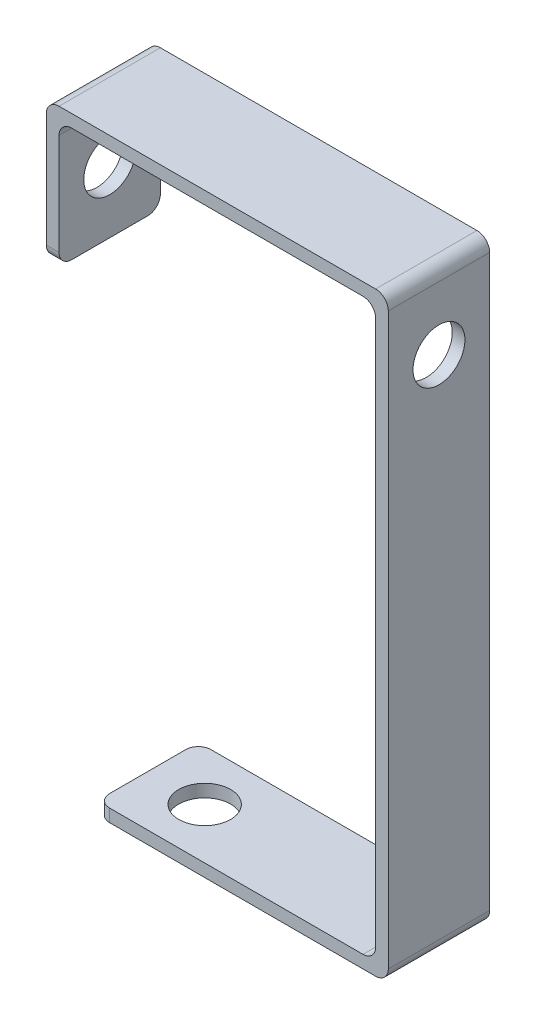
ISO-10303-21;
HEADER;
FILE_DESCRIPTION(('STEP AP214'),'2;1');
FILE_NAME('part.step','',(''),(''),'','','');
FILE_SCHEMA(('AUTOMOTIVE_DESIGN { 1 0 10303 214 1 1 1 1 }'));
ENDSEC;
DATA;
#1=APPLICATION_CONTEXT('core data for automotive mechanical design processes');
#2=APPLICATION_PROTOCOL_DEFINITION('international standard','automotive_design',2000,#1);
#3=PRODUCT_CONTEXT('',#1,'mechanical');
#4=PRODUCT('Part','Part','',(#3));
#5=PRODUCT_RELATED_PRODUCT_CATEGORY('part','',(#4));
#6=PRODUCT_DEFINITION_FORMATION('','',#4);
#7=PRODUCT_DEFINITION_CONTEXT('part definition',#1,'design');
#8=PRODUCT_DEFINITION('design','',#6,#7);
#9=PRODUCT_DEFINITION_SHAPE('','',#8);
#10=(LENGTH_UNIT() NAMED_UNIT(*) SI_UNIT(.MILLI.,.METRE.));
#11=(NAMED_UNIT(*) PLANE_ANGLE_UNIT() SI_UNIT($,.RADIAN.));
#12=(NAMED_UNIT(*) SI_UNIT($,.STERADIAN.) SOLID_ANGLE_UNIT());
#13=UNCERTAINTY_MEASURE_WITH_UNIT(LENGTH_MEASURE(1.E-05),#10,'distance_accuracy_value','');
#14=(GEOMETRIC_REPRESENTATION_CONTEXT(3) GLOBAL_UNCERTAINTY_ASSIGNED_CONTEXT((#13)) GLOBAL_UNIT_ASSIGNED_CONTEXT((#10,
#11,#12)) REPRESENTATION_CONTEXT('',''));
#15=CARTESIAN_POINT('',(0.,0.,0.));
#16=DIRECTION('',(0.,0.,1.));
#17=DIRECTION('',(1.,0.,0.));
#18=AXIS2_PLACEMENT_3D('',#15,#16,#17);
#19=CARTESIAN_POINT('',(0.,-46.,4.));
#20=DIRECTION('',(0.,-1.,0.));
#21=DIRECTION('',(0.,0.,-1.));
#22=AXIS2_PLACEMENT_3D('',#19,#20,#21);
#23=PLANE('',#22);
#24=CARTESIAN_POINT('',(-18.5,-46.,0.));
#25=DIRECTION('',(0.,1.,0.));
#26=DIRECTION('',(0.,0.,1.));
#27=AXIS2_PLACEMENT_3D('',#24,#25,#26);
#28=CIRCLE('',#27,2.05);
#29=CARTESIAN_POINT('',(-18.5,-46.,2.05));
#30=VERTEX_POINT('',#29);
#31=EDGE_CURVE('E421',#30,#30,#28,.T.);
#32=ORIENTED_EDGE('',*,*,#31,.F.);
#33=EDGE_LOOP('',(#32));
#34=FACE_BOUND('',#33,.T.);
#35=DIRECTION('',(1.,0.,0.));
#36=VECTOR('',#35,1.);
#37=CARTESIAN_POINT('',(0.,-46.,4.));
#38=LINE('',#37,#36);
#39=CARTESIAN_POINT('',(-1.99999999999999,-46.,4.));
#40=VERTEX_POINT('',#39);
#41=CARTESIAN_POINT('',(-22.,-46.,4.));
#42=VERTEX_POINT('',#41);
#43=EDGE_CURVE('E398',#40,#42,#38,.F.);
#44=ORIENTED_EDGE('',*,*,#43,.F.);
#45=DIRECTION('',(0.,0.,-1.));
#46=VECTOR('',#45,1.);
#47=CARTESIAN_POINT('',(-1.99999999999999,-46.,-4.));
#48=LINE('',#47,#46);
#49=CARTESIAN_POINT('',(-1.99999999999999,-46.,-4.));
#50=VERTEX_POINT('',#49);
#51=EDGE_CURVE('E299',#40,#50,#48,.T.);
#52=ORIENTED_EDGE('',*,*,#51,.T.);
#53=DIRECTION('',(1.,0.,0.));
#54=VECTOR('',#53,1.);
#55=CARTESIAN_POINT('',(0.,-46.,-4.));
#56=LINE('',#55,#54);
#57=CARTESIAN_POINT('',(-22.,-46.,-4.));
#58=VERTEX_POINT('',#57);
#59=EDGE_CURVE('E372',#50,#58,#56,.F.);
#60=ORIENTED_EDGE('',*,*,#59,.T.);
#61=CARTESIAN_POINT('',(-22.,-46.,-3.));
#62=DIRECTION('',(0.,-1.,0.));
#63=DIRECTION('',(0.,0.,-1.));
#64=AXIS2_PLACEMENT_3D('',#61,#62,#63);
#65=CIRCLE('',#64,1.);
#66=CARTESIAN_POINT('',(-23.,-46.,-3.));
#67=VERTEX_POINT('',#66);
#68=EDGE_CURVE('E214',#58,#67,#65,.F.);
#69=ORIENTED_EDGE('',*,*,#68,.T.);
#70=DIRECTION('',(0.,0.,-1.));
#71=VECTOR('',#70,1.);
#72=CARTESIAN_POINT('',(-23.,-46.,4.));
#73=LINE('',#72,#71);
#74=CARTESIAN_POINT('',(-23.,-46.,3.));
#75=VERTEX_POINT('',#74);
#76=EDGE_CURVE('E208',#75,#67,#73,.T.);
#77=ORIENTED_EDGE('',*,*,#76,.F.);
#78=CARTESIAN_POINT('',(-22.,-46.,3.));
#79=DIRECTION('',(0.,-1.,0.));
#80=DIRECTION('',(0.,0.,-1.));
#81=AXIS2_PLACEMENT_3D('',#78,#79,#80);
#82=CIRCLE('',#81,1.);
#83=EDGE_CURVE('E213',#75,#42,#82,.F.);
#84=ORIENTED_EDGE('',*,*,#83,.T.);
#85=EDGE_LOOP('',(#44,#52,#60,#69,#77,#84));
#86=FACE_BOUND('',#85,.T.);
#87=ADVANCED_FACE('F44',(#34,#86),#23,.F.);
#88=CARTESIAN_POINT('',(-23.,-47.,4.));
#89=DIRECTION('',(-1.,0.,0.));
#90=DIRECTION('',(0.,0.,1.));
#91=AXIS2_PLACEMENT_3D('',#88,#89,#90);
#92=PLANE('',#91);
#93=DIRECTION('',(0.,0.,-1.));
#94=VECTOR('',#93,1.);
#95=CARTESIAN_POINT('',(-23.,-47.,4.));
#96=LINE('',#95,#94);
#97=CARTESIAN_POINT('',(-23.,-47.,3.));
#98=VERTEX_POINT('',#97);
#99=CARTESIAN_POINT('',(-23.,-47.,-3.));
#100=VERTEX_POINT('',#99);
#101=EDGE_CURVE('E189',#98,#100,#96,.T.);
#102=ORIENTED_EDGE('',*,*,#101,.F.);
#103=DIRECTION('',(0.,1.,0.));
#104=VECTOR('',#103,1.);
#105=CARTESIAN_POINT('',(-23.,-47.,3.));
#106=LINE('',#105,#104);
#107=EDGE_CURVE('E201',#98,#75,#106,.T.);
#108=ORIENTED_EDGE('',*,*,#107,.T.);
#109=ORIENTED_EDGE('',*,*,#76,.T.);
#110=DIRECTION('',(0.,1.,0.));
#111=VECTOR('',#110,1.);
#112=CARTESIAN_POINT('',(-23.,-47.,-3.));
#113=LINE('',#112,#111);
#114=EDGE_CURVE('E206',#67,#100,#113,.F.);
#115=ORIENTED_EDGE('',*,*,#114,.T.);
#116=EDGE_LOOP('',(#102,#108,#109,#115));
#117=FACE_BOUND('',#116,.T.);
#118=ADVANCED_FACE('F203',(#117),#92,.T.);
#119=CARTESIAN_POINT('',(0.,-47.,4.));
#120=DIRECTION('',(0.,-1.,0.));
#121=DIRECTION('',(0.,0.,-1.));
#122=AXIS2_PLACEMENT_3D('',#119,#120,#121);
#123=PLANE('',#122);
#124=CARTESIAN_POINT('',(-18.5,-47.,0.));
#125=DIRECTION('',(0.,1.,0.));
#126=DIRECTION('',(0.,0.,1.));
#127=AXIS2_PLACEMENT_3D('',#124,#125,#126);
#128=CIRCLE('',#127,2.05);
#129=CARTESIAN_POINT('',(-18.5,-47.,2.05));
#130=VERTEX_POINT('',#129);
#131=EDGE_CURVE('E419',#130,#130,#128,.T.);
#132=ORIENTED_EDGE('',*,*,#131,.T.);
#133=EDGE_LOOP('',(#132));
#134=FACE_BOUND('',#133,.T.);
#135=DIRECTION('',(-1.,0.,0.));
#136=VECTOR('',#135,1.);
#137=CARTESIAN_POINT('',(0.,-47.,-4.));
#138=LINE('',#137,#136);
#139=CARTESIAN_POINT('',(-0.999999999999994,-47.,-4.));
#140=VERTEX_POINT('',#139);
#141=CARTESIAN_POINT('',(-22.,-47.,-4.));
#142=VERTEX_POINT('',#141);
#143=EDGE_CURVE('E380',#140,#142,#138,.T.);
#144=ORIENTED_EDGE('',*,*,#143,.F.);
#145=DIRECTION('',(0.,0.,-1.));
#146=VECTOR('',#145,1.);
#147=CARTESIAN_POINT('',(-0.999999999999994,-47.,4.));
#148=LINE('',#147,#146);
#149=CARTESIAN_POINT('',(-0.999999999999994,-47.,4.));
#150=VERTEX_POINT('',#149);
#151=EDGE_CURVE('E294',#140,#150,#148,.F.);
#152=ORIENTED_EDGE('',*,*,#151,.T.);
#153=DIRECTION('',(-1.,0.,0.));
#154=VECTOR('',#153,1.);
#155=CARTESIAN_POINT('',(0.,-47.,4.));
#156=LINE('',#155,#154);
#157=CARTESIAN_POINT('',(-22.,-47.,4.));
#158=VERTEX_POINT('',#157);
#159=EDGE_CURVE('E188',#150,#158,#156,.T.);
#160=ORIENTED_EDGE('',*,*,#159,.T.);
#161=CARTESIAN_POINT('',(-22.,-47.,3.));
#162=DIRECTION('',(0.,-1.,0.));
#163=DIRECTION('',(0.,0.,-1.));
#164=AXIS2_PLACEMENT_3D('',#161,#162,#163);
#165=CIRCLE('',#164,1.);
#166=EDGE_CURVE('E185',#158,#98,#165,.T.);
#167=ORIENTED_EDGE('',*,*,#166,.T.);
#168=ORIENTED_EDGE('',*,*,#101,.T.);
#169=CARTESIAN_POINT('',(-22.,-47.,-3.));
#170=DIRECTION('',(0.,-1.,0.));
#171=DIRECTION('',(0.,0.,-1.));
#172=AXIS2_PLACEMENT_3D('',#169,#170,#171);
#173=CIRCLE('',#172,1.);
#174=EDGE_CURVE('E197',#100,#142,#173,.T.);
#175=ORIENTED_EDGE('',*,*,#174,.T.);
#176=EDGE_LOOP('',(#144,#152,#160,#167,#168,#175));
#177=FACE_BOUND('',#176,.T.);
#178=ADVANCED_FACE('F183',(#134,#177),#123,.T.);
#179=CARTESIAN_POINT('',(0.,0.,4.));
#180=DIRECTION('',(1.,0.,0.));
#181=DIRECTION('',(0.,1.,0.));
#182=AXIS2_PLACEMENT_3D('',#179,#180,#181);
#183=PLANE('',#182);
#184=CARTESIAN_POINT('',(0.,-6.,0.));
#185=DIRECTION('',(1.,0.,0.));
#186=DIRECTION('',(0.,1.,0.));
#187=AXIS2_PLACEMENT_3D('',#184,#185,#186);
#188=CIRCLE('',#187,2.05);
#189=CARTESIAN_POINT('',(0.,-3.95,0.));
#190=VERTEX_POINT('',#189);
#191=EDGE_CURVE('E412',#190,#190,#188,.T.);
#192=ORIENTED_EDGE('',*,*,#191,.F.);
#193=EDGE_LOOP('',(#192));
#194=FACE_BOUND('',#193,.T.);
#195=DIRECTION('',(0.,-1.,0.));
#196=VECTOR('',#195,1.);
#197=CARTESIAN_POINT('',(0.,0.,-4.));
#198=LINE('',#197,#196);
#199=CARTESIAN_POINT('',(0.,-1.,-4.));
#200=VERTEX_POINT('',#199);
#201=CARTESIAN_POINT('',(0.,-46.,-4.));
#202=VERTEX_POINT('',#201);
#203=EDGE_CURVE('E381',#200,#202,#198,.T.);
#204=ORIENTED_EDGE('',*,*,#203,.F.);
#205=DIRECTION('',(0.,0.,-1.));
#206=VECTOR('',#205,1.);
#207=CARTESIAN_POINT('',(0.,-1.,4.));
#208=LINE('',#207,#206);
#209=CARTESIAN_POINT('',(0.,-1.,4.));
#210=VERTEX_POINT('',#209);
#211=EDGE_CURVE('E281',#200,#210,#208,.F.);
#212=ORIENTED_EDGE('',*,*,#211,.T.);
#213=DIRECTION('',(0.,-1.,0.));
#214=VECTOR('',#213,1.);
#215=CARTESIAN_POINT('',(0.,0.,4.));
#216=LINE('',#215,#214);
#217=CARTESIAN_POINT('',(0.,-46.,4.));
#218=VERTEX_POINT('',#217);
#219=EDGE_CURVE('E429',#210,#218,#216,.T.);
#220=ORIENTED_EDGE('',*,*,#219,.T.);
#221=DIRECTION('',(0.,0.,-1.));
#222=VECTOR('',#221,1.);
#223=CARTESIAN_POINT('',(0.,-46.,4.));
#224=LINE('',#223,#222);
#225=EDGE_CURVE('E278',#218,#202,#224,.T.);
#226=ORIENTED_EDGE('',*,*,#225,.T.);
#227=EDGE_LOOP('',(#204,#212,#220,#226));
#228=FACE_BOUND('',#227,.T.);
#229=ADVANCED_FACE('F460',(#194,#228),#183,.T.);
#230=CARTESIAN_POINT('',(-27.,0.,4.));
#231=DIRECTION('',(0.,1.,0.));
#232=DIRECTION('',(0.,0.,1.));
#233=AXIS2_PLACEMENT_3D('',#230,#231,#232);
#234=PLANE('',#233);
#235=DIRECTION('',(1.,0.,0.));
#236=VECTOR('',#235,1.);
#237=CARTESIAN_POINT('',(-27.,0.,-4.));
#238=LINE('',#237,#236);
#239=CARTESIAN_POINT('',(-26.,0.,-4.));
#240=VERTEX_POINT('',#239);
#241=CARTESIAN_POINT('',(-1.,0.,-4.));
#242=VERTEX_POINT('',#241);
#243=EDGE_CURVE('E384',#240,#242,#238,.T.);
#244=ORIENTED_EDGE('',*,*,#243,.F.);
#245=DIRECTION('',(0.,0.,-1.));
#246=VECTOR('',#245,1.);
#247=CARTESIAN_POINT('',(-26.,0.,4.));
#248=LINE('',#247,#246);
#249=CARTESIAN_POINT('',(-26.,0.,4.));
#250=VERTEX_POINT('',#249);
#251=EDGE_CURVE('E62',#240,#250,#248,.F.);
#252=ORIENTED_EDGE('',*,*,#251,.T.);
#253=DIRECTION('',(1.,0.,0.));
#254=VECTOR('',#253,1.);
#255=CARTESIAN_POINT('',(-27.,0.,4.));
#256=LINE('',#255,#254);
#257=CARTESIAN_POINT('',(-1.,0.,4.));
#258=VERTEX_POINT('',#257);
#259=EDGE_CURVE('E432',#250,#258,#256,.T.);
#260=ORIENTED_EDGE('',*,*,#259,.T.);
#261=DIRECTION('',(0.,0.,-1.));
#262=VECTOR('',#261,1.);
#263=CARTESIAN_POINT('',(-1.,0.,4.));
#264=LINE('',#263,#262);
#265=EDGE_CURVE('E269',#258,#242,#264,.T.);
#266=ORIENTED_EDGE('',*,*,#265,.T.);
#267=EDGE_LOOP('',(#244,#252,#260,#266));
#268=FACE_BOUND('',#267,.T.);
#269=ADVANCED_FACE('F448',(#268),#234,.T.);
#270=CARTESIAN_POINT('',(-27.,-11.,4.));
#271=DIRECTION('',(-1.,0.,0.));
#272=DIRECTION('',(0.,0.,1.));
#273=AXIS2_PLACEMENT_3D('',#270,#271,#272);
#274=PLANE('',#273);
#275=CARTESIAN_POINT('',(-27.,-6.,0.));
#276=DIRECTION('',(1.,0.,0.));
#277=DIRECTION('',(0.,1.,0.));
#278=AXIS2_PLACEMENT_3D('',#275,#276,#277);
#279=CIRCLE('',#278,2.05);
#280=CARTESIAN_POINT('',(-27.,-3.95,0.));
#281=VERTEX_POINT('',#280);
#282=EDGE_CURVE('E407',#281,#281,#279,.T.);
#283=ORIENTED_EDGE('',*,*,#282,.T.);
#284=EDGE_LOOP('',(#283));
#285=FACE_BOUND('',#284,.T.);
#286=DIRECTION('',(0.,1.,0.));
#287=VECTOR('',#286,1.);
#288=CARTESIAN_POINT('',(-27.,-11.,4.));
#289=LINE('',#288,#287);
#290=CARTESIAN_POINT('',(-27.,-10.,4.));
#291=VERTEX_POINT('',#290);
#292=CARTESIAN_POINT('',(-27.,-1.,4.));
#293=VERTEX_POINT('',#292);
#294=EDGE_CURVE('E367',#291,#293,#289,.T.);
#295=ORIENTED_EDGE('',*,*,#294,.T.);
#296=DIRECTION('',(0.,0.,-1.));
#297=VECTOR('',#296,1.);
#298=CARTESIAN_POINT('',(-27.,-1.,4.));
#299=LINE('',#298,#297);
#300=CARTESIAN_POINT('',(-27.,-1.,-4.));
#301=VERTEX_POINT('',#300);
#302=EDGE_CURVE('E321',#293,#301,#299,.T.);
#303=ORIENTED_EDGE('',*,*,#302,.T.);
#304=DIRECTION('',(0.,1.,0.));
#305=VECTOR('',#304,1.);
#306=CARTESIAN_POINT('',(-27.,-11.,-4.));
#307=LINE('',#306,#305);
#308=CARTESIAN_POINT('',(-27.,-10.,-4.));
#309=VERTEX_POINT('',#308);
#310=EDGE_CURVE('E349',#309,#301,#307,.T.);
#311=ORIENTED_EDGE('',*,*,#310,.F.);
#312=CARTESIAN_POINT('',(-27.,-10.,-3.));
#313=DIRECTION('',(-1.,0.,0.));
#314=DIRECTION('',(0.,0.,1.));
#315=AXIS2_PLACEMENT_3D('',#312,#313,#314);
#316=CIRCLE('',#315,1.);
#317=CARTESIAN_POINT('',(-27.,-11.,-3.));
#318=VERTEX_POINT('',#317);
#319=EDGE_CURVE('E245',#309,#318,#316,.T.);
#320=ORIENTED_EDGE('',*,*,#319,.T.);
#321=DIRECTION('',(0.,0.,-1.));
#322=VECTOR('',#321,1.);
#323=CARTESIAN_POINT('',(-27.,-11.,4.));
#324=LINE('',#323,#322);
#325=CARTESIAN_POINT('',(-27.,-11.,3.));
#326=VERTEX_POINT('',#325);
#327=EDGE_CURVE('E207',#326,#318,#324,.T.);
#328=ORIENTED_EDGE('',*,*,#327,.F.);
#329=CARTESIAN_POINT('',(-27.,-10.,3.));
#330=DIRECTION('',(-1.,0.,0.));
#331=DIRECTION('',(0.,0.,1.));
#332=AXIS2_PLACEMENT_3D('',#329,#330,#331);
#333=CIRCLE('',#332,1.);
#334=EDGE_CURVE('E238',#326,#291,#333,.T.);
#335=ORIENTED_EDGE('',*,*,#334,.T.);
#336=EDGE_LOOP('',(#295,#303,#311,#320,#328,#335));
#337=FACE_BOUND('',#336,.T.);
#338=ADVANCED_FACE('F442',(#285,#337),#274,.T.);
#339=CARTESIAN_POINT('',(-26.,-11.,4.));
#340=DIRECTION('',(0.,-1.,0.));
#341=DIRECTION('',(0.,0.,-1.));
#342=AXIS2_PLACEMENT_3D('',#339,#340,#341);
#343=PLANE('',#342);
#344=ORIENTED_EDGE('',*,*,#327,.T.);
#345=DIRECTION('',(-1.,0.,0.));
#346=VECTOR('',#345,1.);
#347=CARTESIAN_POINT('',(-26.,-11.,-3.));
#348=LINE('',#347,#346);
#349=CARTESIAN_POINT('',(-26.,-11.,-3.));
#350=VERTEX_POINT('',#349);
#351=EDGE_CURVE('E249',#318,#350,#348,.F.);
#352=ORIENTED_EDGE('',*,*,#351,.T.);
#353=DIRECTION('',(0.,0.,-1.));
#354=VECTOR('',#353,1.);
#355=CARTESIAN_POINT('',(-26.,-11.,4.));
#356=LINE('',#355,#354);
#357=CARTESIAN_POINT('',(-26.,-11.,3.));
#358=VERTEX_POINT('',#357);
#359=EDGE_CURVE('E366',#358,#350,#356,.T.);
#360=ORIENTED_EDGE('',*,*,#359,.F.);
#361=DIRECTION('',(-1.,0.,0.));
#362=VECTOR('',#361,1.);
#363=CARTESIAN_POINT('',(-26.,-11.,3.));
#364=LINE('',#363,#362);
#365=EDGE_CURVE('E248',#358,#326,#364,.T.);
#366=ORIENTED_EDGE('',*,*,#365,.T.);
#367=EDGE_LOOP('',(#344,#352,#360,#366));
#368=FACE_BOUND('',#367,.T.);
#369=ADVANCED_FACE('F517',(#368),#343,.T.);
#370=CARTESIAN_POINT('',(-26.,-11.,4.));
#371=DIRECTION('',(-1.,0.,0.));
#372=DIRECTION('',(0.,0.,1.));
#373=AXIS2_PLACEMENT_3D('',#370,#371,#372);
#374=PLANE('',#373);
#375=CARTESIAN_POINT('',(-26.,-6.,0.));
#376=DIRECTION('',(-1.,0.,0.));
#377=DIRECTION('',(0.,0.,1.));
#378=AXIS2_PLACEMENT_3D('',#375,#376,#377);
#379=CIRCLE('',#378,2.05);
#380=CARTESIAN_POINT('',(-26.,-6.,2.05));
#381=VERTEX_POINT('',#380);
#382=EDGE_CURVE('E378',#381,#381,#379,.T.);
#383=ORIENTED_EDGE('',*,*,#382,.T.);
#384=EDGE_LOOP('',(#383));
#385=FACE_BOUND('',#384,.T.);
#386=DIRECTION('',(0.,1.,0.));
#387=VECTOR('',#386,1.);
#388=CARTESIAN_POINT('',(-26.,-11.,-4.));
#389=LINE('',#388,#387);
#390=CARTESIAN_POINT('',(-26.,-10.,-4.));
#391=VERTEX_POINT('',#390);
#392=CARTESIAN_POINT('',(-26.,-2.,-4.));
#393=VERTEX_POINT('',#392);
#394=EDGE_CURVE('E337',#391,#393,#389,.T.);
#395=ORIENTED_EDGE('',*,*,#394,.T.);
#396=DIRECTION('',(0.,0.,-1.));
#397=VECTOR('',#396,1.);
#398=CARTESIAN_POINT('',(-26.,-2.,4.));
#399=LINE('',#398,#397);
#400=CARTESIAN_POINT('',(-26.,-2.,4.));
#401=VERTEX_POINT('',#400);
#402=EDGE_CURVE('E318',#393,#401,#399,.F.);
#403=ORIENTED_EDGE('',*,*,#402,.T.);
#404=DIRECTION('',(0.,1.,0.));
#405=VECTOR('',#404,1.);
#406=CARTESIAN_POINT('',(-26.,-11.,4.));
#407=LINE('',#406,#405);
#408=CARTESIAN_POINT('',(-26.,-10.,4.));
#409=VERTEX_POINT('',#408);
#410=EDGE_CURVE('E360',#409,#401,#407,.T.);
#411=ORIENTED_EDGE('',*,*,#410,.F.);
#412=CARTESIAN_POINT('',(-26.,-10.,3.));
#413=DIRECTION('',(-1.,0.,0.));
#414=DIRECTION('',(0.,0.,1.));
#415=AXIS2_PLACEMENT_3D('',#412,#413,#414);
#416=CIRCLE('',#415,1.);
#417=EDGE_CURVE('E251',#409,#358,#416,.F.);
#418=ORIENTED_EDGE('',*,*,#417,.T.);
#419=ORIENTED_EDGE('',*,*,#359,.T.);
#420=CARTESIAN_POINT('',(-26.,-10.,-3.));
#421=DIRECTION('',(-1.,0.,0.));
#422=DIRECTION('',(0.,0.,1.));
#423=AXIS2_PLACEMENT_3D('',#420,#421,#422);
#424=CIRCLE('',#423,1.);
#425=EDGE_CURVE('E258',#350,#391,#424,.F.);
#426=ORIENTED_EDGE('',*,*,#425,.T.);
#427=EDGE_LOOP('',(#395,#403,#411,#418,#419,#426));
#428=FACE_BOUND('',#427,.T.);
#429=ADVANCED_FACE('F341',(#385,#428),#374,.F.);
#430=CARTESIAN_POINT('',(-27.,-1.,4.));
#431=DIRECTION('',(0.,1.,0.));
#432=DIRECTION('',(0.,0.,1.));
#433=AXIS2_PLACEMENT_3D('',#430,#431,#432);
#434=PLANE('',#433);
#435=DIRECTION('',(1.,0.,0.));
#436=VECTOR('',#435,1.);
#437=CARTESIAN_POINT('',(-27.,-1.,4.));
#438=LINE('',#437,#436);
#439=CARTESIAN_POINT('',(-25.,-1.,4.));
#440=VERTEX_POINT('',#439);
#441=CARTESIAN_POINT('',(-2.,-1.,4.));
#442=VERTEX_POINT('',#441);
#443=EDGE_CURVE('E358',#440,#442,#438,.T.);
#444=ORIENTED_EDGE('',*,*,#443,.F.);
#445=DIRECTION('',(0.,0.,-1.));
#446=VECTOR('',#445,1.);
#447=CARTESIAN_POINT('',(-25.,-1.,-4.));
#448=LINE('',#447,#446);
#449=CARTESIAN_POINT('',(-25.,-1.,-4.));
#450=VERTEX_POINT('',#449);
#451=EDGE_CURVE('E314',#440,#450,#448,.T.);
#452=ORIENTED_EDGE('',*,*,#451,.T.);
#453=DIRECTION('',(1.,0.,0.));
#454=VECTOR('',#453,1.);
#455=CARTESIAN_POINT('',(-27.,-1.,-4.));
#456=LINE('',#455,#454);
#457=CARTESIAN_POINT('',(-2.,-1.,-4.));
#458=VERTEX_POINT('',#457);
#459=EDGE_CURVE('E340',#450,#458,#456,.T.);
#460=ORIENTED_EDGE('',*,*,#459,.T.);
#461=DIRECTION('',(0.,0.,-1.));
#462=VECTOR('',#461,1.);
#463=CARTESIAN_POINT('',(-2.,-1.,4.));
#464=LINE('',#463,#462);
#465=EDGE_CURVE('E266',#458,#442,#464,.F.);
#466=ORIENTED_EDGE('',*,*,#465,.T.);
#467=EDGE_LOOP('',(#444,#452,#460,#466));
#468=FACE_BOUND('',#467,.T.);
#469=ADVANCED_FACE('F357',(#468),#434,.F.);
#470=CARTESIAN_POINT('',(-1.,0.,4.));
#471=DIRECTION('',(1.,0.,0.));
#472=DIRECTION('',(0.,1.,0.));
#473=AXIS2_PLACEMENT_3D('',#470,#471,#472);
#474=PLANE('',#473);
#475=CARTESIAN_POINT('',(-1.,-6.,0.));
#476=DIRECTION('',(1.,0.,0.));
#477=DIRECTION('',(0.,1.,0.));
#478=AXIS2_PLACEMENT_3D('',#475,#476,#477);
#479=CIRCLE('',#478,2.05);
#480=CARTESIAN_POINT('',(-1.,-3.95,0.));
#481=VERTEX_POINT('',#480);
#482=EDGE_CURVE('E401',#481,#481,#479,.T.);
#483=ORIENTED_EDGE('',*,*,#482,.T.);
#484=EDGE_LOOP('',(#483));
#485=FACE_BOUND('',#484,.T.);
#486=DIRECTION('',(0.,-1.,0.));
#487=VECTOR('',#486,1.);
#488=CARTESIAN_POINT('',(-1.,0.,4.));
#489=LINE('',#488,#487);
#490=CARTESIAN_POINT('',(-1.,-2.,4.));
#491=VERTEX_POINT('',#490);
#492=CARTESIAN_POINT('',(-0.999999999999995,-45.,4.));
#493=VERTEX_POINT('',#492);
#494=EDGE_CURVE('E361',#491,#493,#489,.T.);
#495=ORIENTED_EDGE('',*,*,#494,.F.);
#496=DIRECTION('',(0.,0.,-1.));
#497=VECTOR('',#496,1.);
#498=CARTESIAN_POINT('',(-1.,-2.,-4.));
#499=LINE('',#498,#497);
#500=CARTESIAN_POINT('',(-1.,-2.,-4.));
#501=VERTEX_POINT('',#500);
#502=EDGE_CURVE('E265',#491,#501,#499,.T.);
#503=ORIENTED_EDGE('',*,*,#502,.T.);
#504=DIRECTION('',(0.,-1.,0.));
#505=VECTOR('',#504,1.);
#506=CARTESIAN_POINT('',(-1.,0.,-4.));
#507=LINE('',#506,#505);
#508=CARTESIAN_POINT('',(-0.999999999999995,-45.,-4.));
#509=VERTEX_POINT('',#508);
#510=EDGE_CURVE('E394',#501,#509,#507,.T.);
#511=ORIENTED_EDGE('',*,*,#510,.T.);
#512=DIRECTION('',(0.,0.,-1.));
#513=VECTOR('',#512,1.);
#514=CARTESIAN_POINT('',(-0.999999999999995,-45.,4.));
#515=LINE('',#514,#513);
#516=EDGE_CURVE('E259',#509,#493,#515,.F.);
#517=ORIENTED_EDGE('',*,*,#516,.T.);
#518=EDGE_LOOP('',(#495,#503,#511,#517));
#519=FACE_BOUND('',#518,.T.);
#520=ADVANCED_FACE('F476',(#485,#519),#474,.F.);
#521=CARTESIAN_POINT('',(0.,0.,4.));
#522=DIRECTION('',(0.,0.,1.));
#523=DIRECTION('',(1.,0.,0.));
#524=AXIS2_PLACEMENT_3D('',#521,#522,#523);
#525=PLANE('',#524);
#526=ORIENTED_EDGE('',*,*,#259,.F.);
#527=CARTESIAN_POINT('',(-26.,-1.,4.));
#528=DIRECTION('',(0.,0.,1.));
#529=DIRECTION('',(1.,0.,0.));
#530=AXIS2_PLACEMENT_3D('',#527,#528,#529);
#531=CIRCLE('',#530,1.);
#532=EDGE_CURVE('E328',#250,#293,#531,.T.);
#533=ORIENTED_EDGE('',*,*,#532,.T.);
#534=ORIENTED_EDGE('',*,*,#294,.F.);
#535=DIRECTION('',(-1.,0.,0.));
#536=VECTOR('',#535,1.);
#537=CARTESIAN_POINT('',(0.,-10.,4.));
#538=LINE('',#537,#536);
#539=EDGE_CURVE('E223',#291,#409,#538,.F.);
#540=ORIENTED_EDGE('',*,*,#539,.T.);
#541=ORIENTED_EDGE('',*,*,#410,.T.);
#542=CARTESIAN_POINT('',(-25.,-2.,4.));
#543=DIRECTION('',(0.,0.,1.));
#544=DIRECTION('',(1.,0.,0.));
#545=AXIS2_PLACEMENT_3D('',#542,#543,#544);
#546=CIRCLE('',#545,1.);
#547=EDGE_CURVE('E11',#401,#440,#546,.F.);
#548=ORIENTED_EDGE('',*,*,#547,.T.);
#549=ORIENTED_EDGE('',*,*,#443,.T.);
#550=CARTESIAN_POINT('',(-2.,-2.,4.));
#551=DIRECTION('',(0.,0.,1.));
#552=DIRECTION('',(1.,0.,0.));
#553=AXIS2_PLACEMENT_3D('',#550,#551,#552);
#554=CIRCLE('',#553,1.);
#555=EDGE_CURVE('E304',#442,#491,#554,.F.);
#556=ORIENTED_EDGE('',*,*,#555,.T.);
#557=ORIENTED_EDGE('',*,*,#494,.T.);
#558=CARTESIAN_POINT('',(-1.99999999999999,-45.,4.));
#559=DIRECTION('',(0.,0.,1.));
#560=DIRECTION('',(1.,0.,0.));
#561=AXIS2_PLACEMENT_3D('',#558,#559,#560);
#562=CIRCLE('',#561,1.);
#563=EDGE_CURVE('E313',#493,#40,#562,.F.);
#564=ORIENTED_EDGE('',*,*,#563,.T.);
#565=ORIENTED_EDGE('',*,*,#43,.T.);
#566=DIRECTION('',(0.,1.,0.));
#567=VECTOR('',#566,1.);
#568=CARTESIAN_POINT('',(-22.,0.,4.));
#569=LINE('',#568,#567);
#570=EDGE_CURVE('E230',#42,#158,#569,.F.);
#571=ORIENTED_EDGE('',*,*,#570,.T.);
#572=ORIENTED_EDGE('',*,*,#159,.F.);
#573=CARTESIAN_POINT('',(-0.999999999999994,-46.,4.));
#574=DIRECTION('',(0.,0.,1.));
#575=DIRECTION('',(1.,0.,0.));
#576=AXIS2_PLACEMENT_3D('',#573,#574,#575);
#577=CIRCLE('',#576,1.);
#578=EDGE_CURVE('E290',#150,#218,#577,.T.);
#579=ORIENTED_EDGE('',*,*,#578,.T.);
#580=ORIENTED_EDGE('',*,*,#219,.F.);
#581=CARTESIAN_POINT('',(-1.,-1.,4.));
#582=DIRECTION('',(0.,0.,1.));
#583=DIRECTION('',(1.,0.,0.));
#584=AXIS2_PLACEMENT_3D('',#581,#582,#583);
#585=CIRCLE('',#584,1.);
#586=EDGE_CURVE('E289',#210,#258,#585,.T.);
#587=ORIENTED_EDGE('',*,*,#586,.T.);
#588=EDGE_LOOP('',(#526,#533,#534,#540,#541,#548,#549,#556,#557,#564,#565,#571,#572,#579,#580,#587));
#589=FACE_BOUND('',#588,.T.);
#590=ADVANCED_FACE('F353',(#589),#525,.T.);
#591=CARTESIAN_POINT('',(0.,0.,-4.));
#592=DIRECTION('',(0.,0.,1.));
#593=DIRECTION('',(1.,0.,0.));
#594=AXIS2_PLACEMENT_3D('',#591,#592,#593);
#595=PLANE('',#594);
#596=ORIENTED_EDGE('',*,*,#310,.T.);
#597=CARTESIAN_POINT('',(-26.,-1.,-4.));
#598=DIRECTION('',(0.,0.,1.));
#599=DIRECTION('',(1.,0.,0.));
#600=AXIS2_PLACEMENT_3D('',#597,#598,#599);
#601=CIRCLE('',#600,1.);
#602=EDGE_CURVE('E67',#301,#240,#601,.F.);
#603=ORIENTED_EDGE('',*,*,#602,.T.);
#604=ORIENTED_EDGE('',*,*,#243,.T.);
#605=CARTESIAN_POINT('',(-1.,-1.,-4.));
#606=DIRECTION('',(0.,0.,1.));
#607=DIRECTION('',(1.,0.,0.));
#608=AXIS2_PLACEMENT_3D('',#605,#606,#607);
#609=CIRCLE('',#608,1.);
#610=EDGE_CURVE('E280',#242,#200,#609,.F.);
#611=ORIENTED_EDGE('',*,*,#610,.T.);
#612=ORIENTED_EDGE('',*,*,#203,.T.);
#613=CARTESIAN_POINT('',(-0.999999999999994,-46.,-4.));
#614=DIRECTION('',(0.,0.,1.));
#615=DIRECTION('',(1.,0.,0.));
#616=AXIS2_PLACEMENT_3D('',#613,#614,#615);
#617=CIRCLE('',#616,1.);
#618=EDGE_CURVE('E273',#202,#140,#617,.F.);
#619=ORIENTED_EDGE('',*,*,#618,.T.);
#620=ORIENTED_EDGE('',*,*,#143,.T.);
#621=DIRECTION('',(0.,1.,0.));
#622=VECTOR('',#621,1.);
#623=CARTESIAN_POINT('',(-22.,-46.,-4.));
#624=LINE('',#623,#622);
#625=EDGE_CURVE('E237',#142,#58,#624,.T.);
#626=ORIENTED_EDGE('',*,*,#625,.T.);
#627=ORIENTED_EDGE('',*,*,#59,.F.);
#628=CARTESIAN_POINT('',(-1.99999999999999,-45.,-4.));
#629=DIRECTION('',(0.,0.,1.));
#630=DIRECTION('',(1.,0.,0.));
#631=AXIS2_PLACEMENT_3D('',#628,#629,#630);
#632=CIRCLE('',#631,1.);
#633=EDGE_CURVE('E306',#50,#509,#632,.T.);
#634=ORIENTED_EDGE('',*,*,#633,.T.);
#635=ORIENTED_EDGE('',*,*,#510,.F.);
#636=CARTESIAN_POINT('',(-2.,-2.,-4.));
#637=DIRECTION('',(0.,0.,1.));
#638=DIRECTION('',(1.,0.,0.));
#639=AXIS2_PLACEMENT_3D('',#636,#637,#638);
#640=CIRCLE('',#639,1.);
#641=EDGE_CURVE('E303',#501,#458,#640,.T.);
#642=ORIENTED_EDGE('',*,*,#641,.T.);
#643=ORIENTED_EDGE('',*,*,#459,.F.);
#644=CARTESIAN_POINT('',(-25.,-2.,-4.));
#645=DIRECTION('',(0.,0.,1.));
#646=DIRECTION('',(1.,0.,0.));
#647=AXIS2_PLACEMENT_3D('',#644,#645,#646);
#648=CIRCLE('',#647,1.);
#649=EDGE_CURVE('E53',#450,#393,#648,.T.);
#650=ORIENTED_EDGE('',*,*,#649,.T.);
#651=ORIENTED_EDGE('',*,*,#394,.F.);
#652=DIRECTION('',(-1.,0.,0.));
#653=VECTOR('',#652,1.);
#654=CARTESIAN_POINT('',(-27.,-10.,-4.));
#655=LINE('',#654,#653);
#656=EDGE_CURVE('E198',#391,#309,#655,.T.);
#657=ORIENTED_EDGE('',*,*,#656,.T.);
#658=EDGE_LOOP('',(#596,#603,#604,#611,#612,#619,#620,#626,#627,#634,#635,#642,#643,#650,#651,#657));
#659=FACE_BOUND('',#658,.T.);
#660=ADVANCED_FACE('F333',(#659),#595,.F.);
#661=CARTESIAN_POINT('',(-27.,-6.,0.));
#662=DIRECTION('',(1.,0.,0.));
#663=DIRECTION('',(0.,1.,0.));
#664=AXIS2_PLACEMENT_3D('',#661,#662,#663);
#665=CYLINDRICAL_SURFACE('',#664,2.05);
#666=ORIENTED_EDGE('',*,*,#191,.T.);
#667=EDGE_LOOP('',(#666));
#668=FACE_BOUND('',#667,.T.);
#669=ORIENTED_EDGE('',*,*,#482,.F.);
#670=EDGE_LOOP('',(#669));
#671=FACE_BOUND('',#670,.T.);
#672=ADVANCED_FACE('F552',(#668,#671),#665,.F.);
#673=ORIENTED_EDGE('',*,*,#282,.F.);
#674=EDGE_LOOP('',(#673));
#675=FACE_BOUND('',#674,.T.);
#676=ORIENTED_EDGE('',*,*,#382,.F.);
#677=EDGE_LOOP('',(#676));
#678=FACE_BOUND('',#677,.T.);
#679=ADVANCED_FACE('F546',(#675,#678),#665,.F.);
#680=CARTESIAN_POINT('',(-18.5,-47.,0.));
#681=DIRECTION('',(0.,1.,0.));
#682=DIRECTION('',(0.,0.,1.));
#683=AXIS2_PLACEMENT_3D('',#680,#681,#682);
#684=CYLINDRICAL_SURFACE('',#683,2.05);
#685=ORIENTED_EDGE('',*,*,#131,.F.);
#686=EDGE_LOOP('',(#685));
#687=FACE_BOUND('',#686,.T.);
#688=ORIENTED_EDGE('',*,*,#31,.T.);
#689=EDGE_LOOP('',(#688));
#690=FACE_BOUND('',#689,.T.);
#691=ADVANCED_FACE('F510',(#687,#690),#684,.F.);
#692=CARTESIAN_POINT('',(-22.,-47.,3.));
#693=DIRECTION('',(0.,1.,0.));
#694=DIRECTION('',(0.,0.,1.));
#695=AXIS2_PLACEMENT_3D('',#692,#693,#694);
#696=CYLINDRICAL_SURFACE('',#695,1.);
#697=ORIENTED_EDGE('',*,*,#166,.F.);
#698=ORIENTED_EDGE('',*,*,#570,.F.);
#699=ORIENTED_EDGE('',*,*,#83,.F.);
#700=ORIENTED_EDGE('',*,*,#107,.F.);
#701=EDGE_LOOP('',(#697,#698,#699,#700));
#702=FACE_BOUND('',#701,.T.);
#703=ADVANCED_FACE('F211',(#702),#696,.T.);
#704=CARTESIAN_POINT('',(-22.,0.,-3.));
#705=DIRECTION('',(0.,-1.,0.));
#706=DIRECTION('',(0.,0.,-1.));
#707=AXIS2_PLACEMENT_3D('',#704,#705,#706);
#708=CYLINDRICAL_SURFACE('',#707,1.);
#709=ORIENTED_EDGE('',*,*,#174,.F.);
#710=ORIENTED_EDGE('',*,*,#114,.F.);
#711=ORIENTED_EDGE('',*,*,#68,.F.);
#712=ORIENTED_EDGE('',*,*,#625,.F.);
#713=EDGE_LOOP('',(#709,#710,#711,#712));
#714=FACE_BOUND('',#713,.T.);
#715=ADVANCED_FACE('F468',(#714),#708,.T.);
#716=CARTESIAN_POINT('',(0.,-10.,-3.));
#717=DIRECTION('',(1.,0.,0.));
#718=DIRECTION('',(0.,0.,-1.));
#719=AXIS2_PLACEMENT_3D('',#716,#717,#718);
#720=CYLINDRICAL_SURFACE('',#719,1.);
#721=ORIENTED_EDGE('',*,*,#425,.F.);
#722=ORIENTED_EDGE('',*,*,#351,.F.);
#723=ORIENTED_EDGE('',*,*,#319,.F.);
#724=ORIENTED_EDGE('',*,*,#656,.F.);
#725=EDGE_LOOP('',(#721,#722,#723,#724));
#726=FACE_BOUND('',#725,.T.);
#727=ADVANCED_FACE('F491',(#726),#720,.T.);
#728=CARTESIAN_POINT('',(-26.,-10.,3.));
#729=DIRECTION('',(-1.,0.,0.));
#730=DIRECTION('',(0.,0.,1.));
#731=AXIS2_PLACEMENT_3D('',#728,#729,#730);
#732=CYLINDRICAL_SURFACE('',#731,1.);
#733=ORIENTED_EDGE('',*,*,#417,.F.);
#734=ORIENTED_EDGE('',*,*,#539,.F.);
#735=ORIENTED_EDGE('',*,*,#334,.F.);
#736=ORIENTED_EDGE('',*,*,#365,.F.);
#737=EDGE_LOOP('',(#733,#734,#735,#736));
#738=FACE_BOUND('',#737,.T.);
#739=ADVANCED_FACE('F483',(#738),#732,.T.);
#740=CARTESIAN_POINT('',(-2.,-2.,4.));
#741=DIRECTION('',(0.,0.,1.));
#742=DIRECTION('',(1.,0.,0.));
#743=AXIS2_PLACEMENT_3D('',#740,#741,#742);
#744=CYLINDRICAL_SURFACE('',#743,1.);
#745=ORIENTED_EDGE('',*,*,#555,.F.);
#746=ORIENTED_EDGE('',*,*,#465,.F.);
#747=ORIENTED_EDGE('',*,*,#641,.F.);
#748=ORIENTED_EDGE('',*,*,#502,.F.);
#749=EDGE_LOOP('',(#745,#746,#747,#748));
#750=FACE_BOUND('',#749,.T.);
#751=ADVANCED_FACE('F481',(#750),#744,.F.);
#752=CARTESIAN_POINT('',(-1.,-1.,4.));
#753=DIRECTION('',(0.,0.,-1.));
#754=DIRECTION('',(-1.,0.,0.));
#755=AXIS2_PLACEMENT_3D('',#752,#753,#754);
#756=CYLINDRICAL_SURFACE('',#755,1.);
#757=ORIENTED_EDGE('',*,*,#586,.F.);
#758=ORIENTED_EDGE('',*,*,#211,.F.);
#759=ORIENTED_EDGE('',*,*,#610,.F.);
#760=ORIENTED_EDGE('',*,*,#265,.F.);
#761=EDGE_LOOP('',(#757,#758,#759,#760));
#762=FACE_BOUND('',#761,.T.);
#763=ADVANCED_FACE('F451',(#762),#756,.T.);
#764=CARTESIAN_POINT('',(-0.999999999999994,-46.,4.));
#765=DIRECTION('',(0.,0.,-1.));
#766=DIRECTION('',(-1.,0.,0.));
#767=AXIS2_PLACEMENT_3D('',#764,#765,#766);
#768=CYLINDRICAL_SURFACE('',#767,1.);
#769=ORIENTED_EDGE('',*,*,#578,.F.);
#770=ORIENTED_EDGE('',*,*,#151,.F.);
#771=ORIENTED_EDGE('',*,*,#618,.F.);
#772=ORIENTED_EDGE('',*,*,#225,.F.);
#773=EDGE_LOOP('',(#769,#770,#771,#772));
#774=FACE_BOUND('',#773,.T.);
#775=ADVANCED_FACE('F462',(#774),#768,.T.);
#776=CARTESIAN_POINT('',(-1.99999999999999,-45.,4.));
#777=DIRECTION('',(0.,0.,1.));
#778=DIRECTION('',(1.,0.,0.));
#779=AXIS2_PLACEMENT_3D('',#776,#777,#778);
#780=CYLINDRICAL_SURFACE('',#779,1.);
#781=ORIENTED_EDGE('',*,*,#563,.F.);
#782=ORIENTED_EDGE('',*,*,#516,.F.);
#783=ORIENTED_EDGE('',*,*,#633,.F.);
#784=ORIENTED_EDGE('',*,*,#51,.F.);
#785=EDGE_LOOP('',(#781,#782,#783,#784));
#786=FACE_BOUND('',#785,.T.);
#787=ADVANCED_FACE('F475',(#786),#780,.F.);
#788=CARTESIAN_POINT('',(-25.,-2.,4.));
#789=DIRECTION('',(0.,0.,1.));
#790=DIRECTION('',(1.,0.,0.));
#791=AXIS2_PLACEMENT_3D('',#788,#789,#790);
#792=CYLINDRICAL_SURFACE('',#791,1.);
#793=ORIENTED_EDGE('',*,*,#547,.F.);
#794=ORIENTED_EDGE('',*,*,#402,.F.);
#795=ORIENTED_EDGE('',*,*,#649,.F.);
#796=ORIENTED_EDGE('',*,*,#451,.F.);
#797=EDGE_LOOP('',(#793,#794,#795,#796));
#798=FACE_BOUND('',#797,.T.);
#799=ADVANCED_FACE('F354',(#798),#792,.F.);
#800=CARTESIAN_POINT('',(-26.,-1.,4.));
#801=DIRECTION('',(0.,0.,-1.));
#802=DIRECTION('',(-1.,0.,0.));
#803=AXIS2_PLACEMENT_3D('',#800,#801,#802);
#804=CYLINDRICAL_SURFACE('',#803,1.);
#805=ORIENTED_EDGE('',*,*,#532,.F.);
#806=ORIENTED_EDGE('',*,*,#251,.F.);
#807=ORIENTED_EDGE('',*,*,#602,.F.);
#808=ORIENTED_EDGE('',*,*,#302,.F.);
#809=EDGE_LOOP('',(#805,#806,#807,#808));
#810=FACE_BOUND('',#809,.T.);
#811=ADVANCED_FACE('F50',(#810),#804,.T.);
#812=CLOSED_SHELL('',(#87,#118,#178,#229,#269,#338,#369,#429,#469,#520,#590,#660,#672,#679,#691,
#703,#715,#727,#739,#751,#763,#775,#787,#799,#811));
#813=MANIFOLD_SOLID_BREP('B2',#812);
#814=ADVANCED_BREP_SHAPE_REPRESENTATION('',(#18,#813),#14);
#815=SHAPE_DEFINITION_REPRESENTATION(#9,#814);
ENDSEC;
END-ISO-10303-21;
